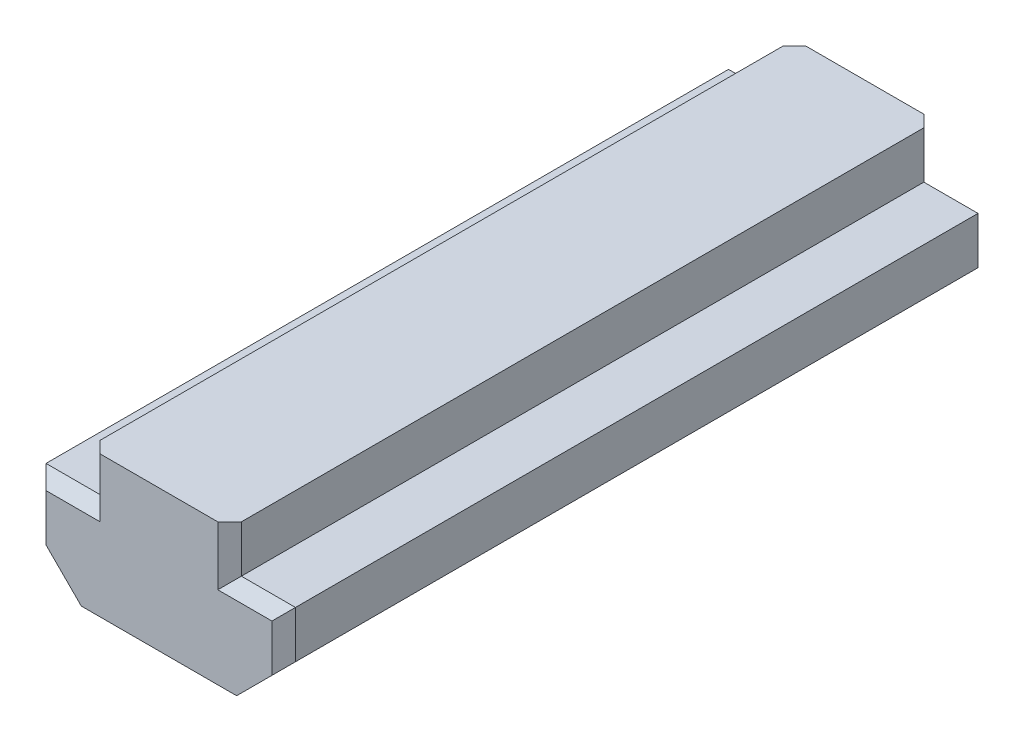
ISO-10303-21;
HEADER;
FILE_DESCRIPTION(('STEP AP214'),'2;1');
FILE_NAME('part.step','',(''),(''),'','','');
FILE_SCHEMA(('AUTOMOTIVE_DESIGN { 1 0 10303 214 1 1 1 1 }'));
ENDSEC;
DATA;
#1=APPLICATION_CONTEXT('core data for automotive mechanical design processes');
#2=APPLICATION_PROTOCOL_DEFINITION('international standard','automotive_design',2000,#1);
#3=PRODUCT_CONTEXT('',#1,'mechanical');
#4=PRODUCT('Part','Part','',(#3));
#5=PRODUCT_RELATED_PRODUCT_CATEGORY('part','',(#4));
#6=PRODUCT_DEFINITION_FORMATION('','',#4);
#7=PRODUCT_DEFINITION_CONTEXT('part definition',#1,'design');
#8=PRODUCT_DEFINITION('design','',#6,#7);
#9=PRODUCT_DEFINITION_SHAPE('','',#8);
#10=(LENGTH_UNIT() NAMED_UNIT(*) SI_UNIT(.MILLI.,.METRE.));
#11=(NAMED_UNIT(*) PLANE_ANGLE_UNIT() SI_UNIT($,.RADIAN.));
#12=(NAMED_UNIT(*) SI_UNIT($,.STERADIAN.) SOLID_ANGLE_UNIT());
#13=UNCERTAINTY_MEASURE_WITH_UNIT(LENGTH_MEASURE(1.E-05),#10,'distance_accuracy_value','');
#14=(GEOMETRIC_REPRESENTATION_CONTEXT(3) GLOBAL_UNCERTAINTY_ASSIGNED_CONTEXT((#13)) GLOBAL_UNIT_ASSIGNED_CONTEXT((#10,
#11,#12)) REPRESENTATION_CONTEXT('',''));
#15=CARTESIAN_POINT('',(0.,0.,0.));
#16=DIRECTION('',(0.,0.,1.));
#17=DIRECTION('',(1.,0.,0.));
#18=AXIS2_PLACEMENT_3D('',#15,#16,#17);
#19=CARTESIAN_POINT('',(-3.,0.,15.));
#20=DIRECTION('',(0.,-1.,0.));
#21=DIRECTION('',(0.,0.,-1.));
#22=AXIS2_PLACEMENT_3D('',#19,#20,#21);
#23=PLANE('',#22);
#24=DIRECTION('',(-0.707106781186545,0.,0.70710678118655));
#25=VECTOR('',#24,1.);
#26=CARTESIAN_POINT('',(-2.5,0.,-15.));
#27=LINE('',#26,#25);
#28=CARTESIAN_POINT('',(-3.,0.,-14.5));
#29=VERTEX_POINT('',#28);
#30=CARTESIAN_POINT('',(-2.5,0.,-15.));
#31=VERTEX_POINT('',#30);
#32=EDGE_CURVE('E173',#29,#31,#27,.F.);
#33=ORIENTED_EDGE('',*,*,#32,.F.);
#34=DIRECTION('',(0.,0.,-1.));
#35=VECTOR('',#34,1.);
#36=CARTESIAN_POINT('',(-3.,0.,15.));
#37=LINE('',#36,#35);
#38=CARTESIAN_POINT('',(-3.,0.,14.5));
#39=VERTEX_POINT('',#38);
#40=EDGE_CURVE('E185',#39,#29,#37,.T.);
#41=ORIENTED_EDGE('',*,*,#40,.F.);
#42=DIRECTION('',(-0.707106781186545,0.,-0.70710678118655));
#43=VECTOR('',#42,1.);
#44=CARTESIAN_POINT('',(-2.5,0.,15.));
#45=LINE('',#44,#43);
#46=CARTESIAN_POINT('',(-2.5,0.,15.));
#47=VERTEX_POINT('',#46);
#48=EDGE_CURVE('E243',#39,#47,#45,.F.);
#49=ORIENTED_EDGE('',*,*,#48,.T.);
#50=DIRECTION('',(-1.,0.,0.));
#51=VECTOR('',#50,1.);
#52=CARTESIAN_POINT('',(-3.,0.,15.));
#53=LINE('',#52,#51);
#54=CARTESIAN_POINT('',(2.5,0.,15.));
#55=VERTEX_POINT('',#54);
#56=EDGE_CURVE('E277',#55,#47,#53,.T.);
#57=ORIENTED_EDGE('',*,*,#56,.F.);
#58=DIRECTION('',(-0.707106781186548,0.,0.707106781186548));
#59=VECTOR('',#58,1.);
#60=CARTESIAN_POINT('',(2.5,0.,15.));
#61=LINE('',#60,#59);
#62=CARTESIAN_POINT('',(3.,0.,14.5));
#63=VERTEX_POINT('',#62);
#64=EDGE_CURVE('E241',#55,#63,#61,.F.);
#65=ORIENTED_EDGE('',*,*,#64,.T.);
#66=DIRECTION('',(0.,0.,-1.));
#67=VECTOR('',#66,1.);
#68=CARTESIAN_POINT('',(3.,0.,15.));
#69=LINE('',#68,#67);
#70=CARTESIAN_POINT('',(3.,0.,-14.5));
#71=VERTEX_POINT('',#70);
#72=EDGE_CURVE('E194',#63,#71,#69,.T.);
#73=ORIENTED_EDGE('',*,*,#72,.T.);
#74=DIRECTION('',(-0.707106781186548,0.,-0.707106781186548));
#75=VECTOR('',#74,1.);
#76=CARTESIAN_POINT('',(2.5,0.,-15.));
#77=LINE('',#76,#75);
#78=CARTESIAN_POINT('',(2.5,0.,-15.));
#79=VERTEX_POINT('',#78);
#80=EDGE_CURVE('E331',#79,#71,#77,.F.);
#81=ORIENTED_EDGE('',*,*,#80,.F.);
#82=DIRECTION('',(-1.,0.,0.));
#83=VECTOR('',#82,1.);
#84=CARTESIAN_POINT('',(-3.,0.,-15.));
#85=LINE('',#84,#83);
#86=EDGE_CURVE('E189',#79,#31,#85,.T.);
#87=ORIENTED_EDGE('',*,*,#86,.T.);
#88=EDGE_LOOP('',(#33,#41,#49,#57,#65,#73,#81,#87));
#89=FACE_BOUND('',#88,.T.);
#90=ADVANCED_FACE('F43',(#89),#23,.F.);
#91=CARTESIAN_POINT('',(0.,0.,-15.));
#92=DIRECTION('',(0.,0.,-1.));
#93=DIRECTION('',(-1.,0.,0.));
#94=AXIS2_PLACEMENT_3D('',#91,#92,#93);
#95=PLANE('',#94);
#96=DIRECTION('',(0.707106781186546,-0.707106781186549,0.));
#97=VECTOR('',#96,1.);
#98=CARTESIAN_POINT('',(-4.65000000000001,-4.64999999999999,-15.));
#99=LINE('',#98,#97);
#100=CARTESIAN_POINT('',(-3.3,-6.,-15.));
#101=VERTEX_POINT('',#100);
#102=CARTESIAN_POINT('',(-4.80000000000002,-4.49999999999998,-15.));
#103=VERTEX_POINT('',#102);
#104=EDGE_CURVE('E209',#101,#103,#99,.F.);
#105=ORIENTED_EDGE('',*,*,#104,.T.);
#106=DIRECTION('',(0.,-1.,0.));
#107=VECTOR('',#106,1.);
#108=CARTESIAN_POINT('',(-4.8,0.,-15.));
#109=LINE('',#108,#107);
#110=CARTESIAN_POINT('',(-4.8,-2.5,-15.));
#111=VERTEX_POINT('',#110);
#112=EDGE_CURVE('E61',#111,#103,#109,.T.);
#113=ORIENTED_EDGE('',*,*,#112,.F.);
#114=DIRECTION('',(-1.,0.,0.));
#115=VECTOR('',#114,1.);
#116=CARTESIAN_POINT('',(0.,-2.5,-15.));
#117=LINE('',#116,#115);
#118=CARTESIAN_POINT('',(-2.5,-2.5,-15.));
#119=VERTEX_POINT('',#118);
#120=EDGE_CURVE('E367',#119,#111,#117,.T.);
#121=ORIENTED_EDGE('',*,*,#120,.F.);
#122=DIRECTION('',(0.,-1.,0.));
#123=VECTOR('',#122,1.);
#124=CARTESIAN_POINT('',(-2.5,0.,-15.));
#125=LINE('',#124,#123);
#126=EDGE_CURVE('E375',#31,#119,#125,.T.);
#127=ORIENTED_EDGE('',*,*,#126,.F.);
#128=ORIENTED_EDGE('',*,*,#86,.F.);
#129=DIRECTION('',(0.,1.,0.));
#130=VECTOR('',#129,1.);
#131=CARTESIAN_POINT('',(2.5,0.,-15.));
#132=LINE('',#131,#130);
#133=CARTESIAN_POINT('',(2.5,-2.5,-15.));
#134=VERTEX_POINT('',#133);
#135=EDGE_CURVE('E337',#134,#79,#132,.T.);
#136=ORIENTED_EDGE('',*,*,#135,.F.);
#137=DIRECTION('',(-1.,0.,0.));
#138=VECTOR('',#137,1.);
#139=CARTESIAN_POINT('',(0.,-2.5,-15.));
#140=LINE('',#139,#138);
#141=CARTESIAN_POINT('',(4.8,-2.5,-15.));
#142=VERTEX_POINT('',#141);
#143=EDGE_CURVE('E344',#142,#134,#140,.T.);
#144=ORIENTED_EDGE('',*,*,#143,.F.);
#145=DIRECTION('',(0.,1.,0.));
#146=VECTOR('',#145,1.);
#147=CARTESIAN_POINT('',(4.8,0.,-15.));
#148=LINE('',#147,#146);
#149=CARTESIAN_POINT('',(4.8,-4.5,-15.));
#150=VERTEX_POINT('',#149);
#151=EDGE_CURVE('E263',#150,#142,#148,.T.);
#152=ORIENTED_EDGE('',*,*,#151,.F.);
#153=DIRECTION('',(0.707106781186549,0.707106781186546,0.));
#154=VECTOR('',#153,1.);
#155=CARTESIAN_POINT('',(4.64999999999999,-4.65000000000001,-15.));
#156=LINE('',#155,#154);
#157=CARTESIAN_POINT('',(3.3,-6.,-15.));
#158=VERTEX_POINT('',#157);
#159=EDGE_CURVE('E212',#150,#158,#156,.F.);
#160=ORIENTED_EDGE('',*,*,#159,.T.);
#161=DIRECTION('',(1.,0.,0.));
#162=VECTOR('',#161,1.);
#163=CARTESIAN_POINT('',(5.3,-6.,-15.));
#164=LINE('',#163,#162);
#165=EDGE_CURVE('E281',#101,#158,#164,.T.);
#166=ORIENTED_EDGE('',*,*,#165,.F.);
#167=EDGE_LOOP('',(#105,#113,#121,#127,#128,#136,#144,#152,#160,#166));
#168=FACE_BOUND('',#167,.T.);
#169=ADVANCED_FACE('F351',(#168),#95,.T.);
#170=CARTESIAN_POINT('',(-3.,0.,15.));
#171=DIRECTION('',(1.,0.,0.));
#172=DIRECTION('',(0.,0.,-1.));
#173=AXIS2_PLACEMENT_3D('',#170,#171,#172);
#174=PLANE('',#173);
#175=DIRECTION('',(0.,1.,0.));
#176=VECTOR('',#175,1.);
#177=CARTESIAN_POINT('',(-3.,0.,-14.5));
#178=LINE('',#177,#176);
#179=CARTESIAN_POINT('',(-3.,-2.,-14.5));
#180=VERTEX_POINT('',#179);
#181=EDGE_CURVE('E169',#180,#29,#178,.T.);
#182=ORIENTED_EDGE('',*,*,#181,.F.);
#183=DIRECTION('',(0.,0.,-1.));
#184=VECTOR('',#183,1.);
#185=CARTESIAN_POINT('',(-3.,-2.,15.));
#186=LINE('',#185,#184);
#187=CARTESIAN_POINT('',(-3.,-2.,14.5));
#188=VERTEX_POINT('',#187);
#189=EDGE_CURVE('E195',#188,#180,#186,.T.);
#190=ORIENTED_EDGE('',*,*,#189,.F.);
#191=DIRECTION('',(0.,1.,0.));
#192=VECTOR('',#191,1.);
#193=CARTESIAN_POINT('',(-3.,0.,14.5));
#194=LINE('',#193,#192);
#195=EDGE_CURVE('E193',#188,#39,#194,.T.);
#196=ORIENTED_EDGE('',*,*,#195,.T.);
#197=ORIENTED_EDGE('',*,*,#40,.T.);
#198=EDGE_LOOP('',(#182,#190,#196,#197));
#199=FACE_BOUND('',#198,.T.);
#200=ADVANCED_FACE('F191',(#199),#174,.F.);
#201=CARTESIAN_POINT('',(-3.,-2.,15.));
#202=DIRECTION('',(0.,-1.,0.));
#203=DIRECTION('',(1.,0.,0.));
#204=AXIS2_PLACEMENT_3D('',#201,#202,#203);
#205=PLANE('',#204);
#206=DIRECTION('',(1.,0.,0.));
#207=VECTOR('',#206,1.);
#208=CARTESIAN_POINT('',(-3.,-2.,-14.5));
#209=LINE('',#208,#207);
#210=CARTESIAN_POINT('',(-5.3,-2.,-14.5));
#211=VERTEX_POINT('',#210);
#212=EDGE_CURVE('E303',#211,#180,#209,.T.);
#213=ORIENTED_EDGE('',*,*,#212,.F.);
#214=DIRECTION('',(0.,0.,-1.));
#215=VECTOR('',#214,1.);
#216=CARTESIAN_POINT('',(-5.3,-2.,15.));
#217=LINE('',#216,#215);
#218=CARTESIAN_POINT('',(-5.3,-2.,14.5));
#219=VERTEX_POINT('',#218);
#220=EDGE_CURVE('E200',#219,#211,#217,.T.);
#221=ORIENTED_EDGE('',*,*,#220,.F.);
#222=DIRECTION('',(1.,0.,0.));
#223=VECTOR('',#222,1.);
#224=CARTESIAN_POINT('',(-3.,-2.,14.5));
#225=LINE('',#224,#223);
#226=EDGE_CURVE('E245',#219,#188,#225,.T.);
#227=ORIENTED_EDGE('',*,*,#226,.T.);
#228=ORIENTED_EDGE('',*,*,#189,.T.);
#229=EDGE_LOOP('',(#213,#221,#227,#228));
#230=FACE_BOUND('',#229,.T.);
#231=ADVANCED_FACE('F301',(#230),#205,.F.);
#232=CARTESIAN_POINT('',(-5.3,-2.,15.));
#233=DIRECTION('',(1.,0.,0.));
#234=DIRECTION('',(0.,1.,0.));
#235=AXIS2_PLACEMENT_3D('',#232,#233,#234);
#236=PLANE('',#235);
#237=DIRECTION('',(0.,1.,0.));
#238=VECTOR('',#237,1.);
#239=CARTESIAN_POINT('',(-5.3,-2.,-14.5));
#240=LINE('',#239,#238);
#241=CARTESIAN_POINT('',(-5.3,-3.99999999999999,-14.5));
#242=VERTEX_POINT('',#241);
#243=EDGE_CURVE('E295',#242,#211,#240,.T.);
#244=ORIENTED_EDGE('',*,*,#243,.F.);
#245=DIRECTION('',(0.,0.,1.));
#246=VECTOR('',#245,1.);
#247=CARTESIAN_POINT('',(-5.3,-3.99999999999999,15.));
#248=LINE('',#247,#246);
#249=CARTESIAN_POINT('',(-5.3,-3.99999999999999,14.5));
#250=VERTEX_POINT('',#249);
#251=EDGE_CURVE('E224',#242,#250,#248,.T.);
#252=ORIENTED_EDGE('',*,*,#251,.T.);
#253=DIRECTION('',(0.,1.,0.));
#254=VECTOR('',#253,1.);
#255=CARTESIAN_POINT('',(-5.3,-2.,14.5));
#256=LINE('',#255,#254);
#257=EDGE_CURVE('E250',#250,#219,#256,.T.);
#258=ORIENTED_EDGE('',*,*,#257,.T.);
#259=ORIENTED_EDGE('',*,*,#220,.T.);
#260=EDGE_LOOP('',(#244,#252,#258,#259));
#261=FACE_BOUND('',#260,.T.);
#262=ADVANCED_FACE('F293',(#261),#236,.F.);
#263=CARTESIAN_POINT('',(-3.3,-6.,15.));
#264=DIRECTION('',(0.707106781186549,0.707106781186546,0.));
#265=DIRECTION('',(0.,0.,-1.));
#266=AXIS2_PLACEMENT_3D('',#263,#264,#265);
#267=PLANE('',#266);
#268=ORIENTED_EDGE('',*,*,#251,.F.);
#269=DIRECTION('',(-0.577350269189623,0.577350269189626,0.577350269189628));
#270=VECTOR('',#269,1.);
#271=CARTESIAN_POINT('',(-3.80000000000001,-5.5,-16.));
#272=LINE('',#271,#270);
#273=EDGE_CURVE('E368',#103,#242,#272,.T.);
#274=ORIENTED_EDGE('',*,*,#273,.F.);
#275=ORIENTED_EDGE('',*,*,#104,.F.);
#276=DIRECTION('',(0.,0.,-1.));
#277=VECTOR('',#276,1.);
#278=CARTESIAN_POINT('',(-3.3,-6.,15.));
#279=LINE('',#278,#277);
#280=CARTESIAN_POINT('',(-3.3,-6.,15.));
#281=VERTEX_POINT('',#280);
#282=EDGE_CURVE('E214',#281,#101,#279,.T.);
#283=ORIENTED_EDGE('',*,*,#282,.F.);
#284=DIRECTION('',(-0.707106781186546,0.707106781186549,0.));
#285=VECTOR('',#284,1.);
#286=CARTESIAN_POINT('',(-3.3,-6.,15.));
#287=LINE('',#286,#285);
#288=CARTESIAN_POINT('',(-4.8,-4.5,15.));
#289=VERTEX_POINT('',#288);
#290=EDGE_CURVE('E219',#289,#281,#287,.F.);
#291=ORIENTED_EDGE('',*,*,#290,.F.);
#292=DIRECTION('',(-0.577350269189623,0.577350269189626,-0.577350269189628));
#293=VECTOR('',#292,1.);
#294=CARTESIAN_POINT('',(-3.80000000000001,-5.5,16.));
#295=LINE('',#294,#293);
#296=EDGE_CURVE('E247',#289,#250,#295,.T.);
#297=ORIENTED_EDGE('',*,*,#296,.T.);
#298=EDGE_LOOP('',(#268,#274,#275,#283,#291,#297));
#299=FACE_BOUND('',#298,.T.);
#300=ADVANCED_FACE('F364',(#299),#267,.F.);
#301=CARTESIAN_POINT('',(3.,-2.,15.));
#302=DIRECTION('',(0.,-1.,0.));
#303=DIRECTION('',(1.,0.,0.));
#304=AXIS2_PLACEMENT_3D('',#301,#302,#303);
#305=PLANE('',#304);
#306=DIRECTION('',(1.,0.,0.));
#307=VECTOR('',#306,1.);
#308=CARTESIAN_POINT('',(3.,-2.,-14.5));
#309=LINE('',#308,#307);
#310=CARTESIAN_POINT('',(3.,-2.,-14.5));
#311=VERTEX_POINT('',#310);
#312=CARTESIAN_POINT('',(5.3,-2.,-14.5));
#313=VERTEX_POINT('',#312);
#314=EDGE_CURVE('E341',#311,#313,#309,.T.);
#315=ORIENTED_EDGE('',*,*,#314,.F.);
#316=DIRECTION('',(0.,0.,-1.));
#317=VECTOR('',#316,1.);
#318=CARTESIAN_POINT('',(3.,-2.,15.));
#319=LINE('',#318,#317);
#320=CARTESIAN_POINT('',(3.,-2.,14.5));
#321=VERTEX_POINT('',#320);
#322=EDGE_CURVE('E198',#321,#311,#319,.T.);
#323=ORIENTED_EDGE('',*,*,#322,.F.);
#324=DIRECTION('',(1.,0.,0.));
#325=VECTOR('',#324,1.);
#326=CARTESIAN_POINT('',(3.,-2.,14.5));
#327=LINE('',#326,#325);
#328=CARTESIAN_POINT('',(5.3,-2.,14.5));
#329=VERTEX_POINT('',#328);
#330=EDGE_CURVE('E254',#321,#329,#327,.T.);
#331=ORIENTED_EDGE('',*,*,#330,.T.);
#332=DIRECTION('',(0.,0.,-1.));
#333=VECTOR('',#332,1.);
#334=CARTESIAN_POINT('',(5.3,-2.,15.));
#335=LINE('',#334,#333);
#336=EDGE_CURVE('E284',#329,#313,#335,.T.);
#337=ORIENTED_EDGE('',*,*,#336,.T.);
#338=EDGE_LOOP('',(#315,#323,#331,#337));
#339=FACE_BOUND('',#338,.T.);
#340=ADVANCED_FACE('F387',(#339),#305,.F.);
#341=CARTESIAN_POINT('',(3.,0.,15.));
#342=DIRECTION('',(-1.,0.,0.));
#343=DIRECTION('',(0.,0.,1.));
#344=AXIS2_PLACEMENT_3D('',#341,#342,#343);
#345=PLANE('',#344);
#346=DIRECTION('',(0.,-1.,0.));
#347=VECTOR('',#346,1.);
#348=CARTESIAN_POINT('',(3.,0.,-14.5));
#349=LINE('',#348,#347);
#350=EDGE_CURVE('E326',#71,#311,#349,.T.);
#351=ORIENTED_EDGE('',*,*,#350,.F.);
#352=ORIENTED_EDGE('',*,*,#72,.F.);
#353=DIRECTION('',(0.,-1.,0.));
#354=VECTOR('',#353,1.);
#355=CARTESIAN_POINT('',(3.,0.,14.5));
#356=LINE('',#355,#354);
#357=EDGE_CURVE('E252',#63,#321,#356,.T.);
#358=ORIENTED_EDGE('',*,*,#357,.T.);
#359=ORIENTED_EDGE('',*,*,#322,.T.);
#360=EDGE_LOOP('',(#351,#352,#358,#359));
#361=FACE_BOUND('',#360,.T.);
#362=ADVANCED_FACE('F323',(#361),#345,.F.);
#363=CARTESIAN_POINT('',(5.3,-2.,15.));
#364=DIRECTION('',(-1.,0.,0.));
#365=DIRECTION('',(0.,-1.,0.));
#366=AXIS2_PLACEMENT_3D('',#363,#364,#365);
#367=PLANE('',#366);
#368=DIRECTION('',(0.,-1.,0.));
#369=VECTOR('',#368,1.);
#370=CARTESIAN_POINT('',(5.3,-2.,-14.5));
#371=LINE('',#370,#369);
#372=CARTESIAN_POINT('',(5.3,-4.00000000000001,-14.5));
#373=VERTEX_POINT('',#372);
#374=EDGE_CURVE('E69',#313,#373,#371,.T.);
#375=ORIENTED_EDGE('',*,*,#374,.F.);
#376=ORIENTED_EDGE('',*,*,#336,.F.);
#377=DIRECTION('',(0.,-1.,0.));
#378=VECTOR('',#377,1.);
#379=CARTESIAN_POINT('',(5.3,-2.,14.5));
#380=LINE('',#379,#378);
#381=CARTESIAN_POINT('',(5.3,-4.00000000000001,14.5));
#382=VERTEX_POINT('',#381);
#383=EDGE_CURVE('E53',#329,#382,#380,.T.);
#384=ORIENTED_EDGE('',*,*,#383,.T.);
#385=DIRECTION('',(0.,0.,-1.));
#386=VECTOR('',#385,1.);
#387=CARTESIAN_POINT('',(5.3,-4.00000000000001,15.));
#388=LINE('',#387,#386);
#389=EDGE_CURVE('E206',#382,#373,#388,.T.);
#390=ORIENTED_EDGE('',*,*,#389,.T.);
#391=EDGE_LOOP('',(#375,#376,#384,#390));
#392=FACE_BOUND('',#391,.T.);
#393=ADVANCED_FACE('F385',(#392),#367,.F.);
#394=CARTESIAN_POINT('',(5.3,-4.00000000000001,15.));
#395=DIRECTION('',(-0.707106781186546,0.707106781186549,0.));
#396=DIRECTION('',(0.,0.,-1.));
#397=AXIS2_PLACEMENT_3D('',#394,#395,#396);
#398=PLANE('',#397);
#399=ORIENTED_EDGE('',*,*,#159,.F.);
#400=DIRECTION('',(-0.577350269189627,-0.577350269189624,-0.577350269189627));
#401=VECTOR('',#400,1.);
#402=CARTESIAN_POINT('',(5.13333333333333,-4.16666666666667,-14.6666666666667));
#403=LINE('',#402,#401);
#404=EDGE_CURVE('E273',#373,#150,#403,.T.);
#405=ORIENTED_EDGE('',*,*,#404,.F.);
#406=ORIENTED_EDGE('',*,*,#389,.F.);
#407=DIRECTION('',(-0.577350269189627,-0.577350269189624,0.577350269189627));
#408=VECTOR('',#407,1.);
#409=CARTESIAN_POINT('',(5.13333333333333,-4.16666666666667,14.6666666666667));
#410=LINE('',#409,#408);
#411=CARTESIAN_POINT('',(4.8,-4.5,15.));
#412=VERTEX_POINT('',#411);
#413=EDGE_CURVE('E11',#382,#412,#410,.T.);
#414=ORIENTED_EDGE('',*,*,#413,.T.);
#415=DIRECTION('',(-0.707106781186549,-0.707106781186546,0.));
#416=VECTOR('',#415,1.);
#417=CARTESIAN_POINT('',(5.3,-4.00000000000001,15.));
#418=LINE('',#417,#416);
#419=CARTESIAN_POINT('',(3.3,-6.,15.));
#420=VERTEX_POINT('',#419);
#421=EDGE_CURVE('E221',#420,#412,#418,.F.);
#422=ORIENTED_EDGE('',*,*,#421,.F.);
#423=DIRECTION('',(0.,0.,1.));
#424=VECTOR('',#423,1.);
#425=CARTESIAN_POINT('',(3.3,-6.,15.));
#426=LINE('',#425,#424);
#427=EDGE_CURVE('E217',#158,#420,#426,.T.);
#428=ORIENTED_EDGE('',*,*,#427,.F.);
#429=EDGE_LOOP('',(#399,#405,#406,#414,#422,#428));
#430=FACE_BOUND('',#429,.T.);
#431=ADVANCED_FACE('F355',(#430),#398,.F.);
#432=CARTESIAN_POINT('',(5.3,-6.,15.));
#433=DIRECTION('',(0.,1.,0.));
#434=DIRECTION('',(-1.,0.,0.));
#435=AXIS2_PLACEMENT_3D('',#432,#433,#434);
#436=PLANE('',#435);
#437=ORIENTED_EDGE('',*,*,#165,.T.);
#438=ORIENTED_EDGE('',*,*,#427,.T.);
#439=DIRECTION('',(1.,0.,0.));
#440=VECTOR('',#439,1.);
#441=CARTESIAN_POINT('',(5.3,-6.,15.));
#442=LINE('',#441,#440);
#443=EDGE_CURVE('E280',#281,#420,#442,.T.);
#444=ORIENTED_EDGE('',*,*,#443,.F.);
#445=ORIENTED_EDGE('',*,*,#282,.T.);
#446=EDGE_LOOP('',(#437,#438,#444,#445));
#447=FACE_BOUND('',#446,.T.);
#448=ADVANCED_FACE('F359',(#447),#436,.F.);
#449=CARTESIAN_POINT('',(0.,0.,15.));
#450=DIRECTION('',(0.,0.,-1.));
#451=DIRECTION('',(-1.,0.,0.));
#452=AXIS2_PLACEMENT_3D('',#449,#450,#451);
#453=PLANE('',#452);
#454=ORIENTED_EDGE('',*,*,#56,.T.);
#455=DIRECTION('',(0.,-1.,0.));
#456=VECTOR('',#455,1.);
#457=CARTESIAN_POINT('',(-2.5,0.,15.));
#458=LINE('',#457,#456);
#459=CARTESIAN_POINT('',(-2.5,-2.5,15.));
#460=VERTEX_POINT('',#459);
#461=EDGE_CURVE('E237',#47,#460,#458,.T.);
#462=ORIENTED_EDGE('',*,*,#461,.T.);
#463=DIRECTION('',(-1.,0.,0.));
#464=VECTOR('',#463,1.);
#465=CARTESIAN_POINT('',(0.,-2.5,15.));
#466=LINE('',#465,#464);
#467=CARTESIAN_POINT('',(-4.8,-2.5,15.));
#468=VERTEX_POINT('',#467);
#469=EDGE_CURVE('E235',#460,#468,#466,.T.);
#470=ORIENTED_EDGE('',*,*,#469,.T.);
#471=DIRECTION('',(0.,-1.,0.));
#472=VECTOR('',#471,1.);
#473=CARTESIAN_POINT('',(-4.8,0.,15.));
#474=LINE('',#473,#472);
#475=EDGE_CURVE('E233',#468,#289,#474,.T.);
#476=ORIENTED_EDGE('',*,*,#475,.T.);
#477=ORIENTED_EDGE('',*,*,#290,.T.);
#478=ORIENTED_EDGE('',*,*,#443,.T.);
#479=ORIENTED_EDGE('',*,*,#421,.T.);
#480=DIRECTION('',(0.,1.,0.));
#481=VECTOR('',#480,1.);
#482=CARTESIAN_POINT('',(4.8,0.,15.));
#483=LINE('',#482,#481);
#484=CARTESIAN_POINT('',(4.8,-2.5,15.));
#485=VERTEX_POINT('',#484);
#486=EDGE_CURVE('E226',#412,#485,#483,.T.);
#487=ORIENTED_EDGE('',*,*,#486,.T.);
#488=DIRECTION('',(-1.,0.,0.));
#489=VECTOR('',#488,1.);
#490=CARTESIAN_POINT('',(0.,-2.5,15.));
#491=LINE('',#490,#489);
#492=CARTESIAN_POINT('',(2.5,-2.5,15.));
#493=VERTEX_POINT('',#492);
#494=EDGE_CURVE('E228',#485,#493,#491,.T.);
#495=ORIENTED_EDGE('',*,*,#494,.T.);
#496=DIRECTION('',(0.,1.,0.));
#497=VECTOR('',#496,1.);
#498=CARTESIAN_POINT('',(2.5,0.,15.));
#499=LINE('',#498,#497);
#500=EDGE_CURVE('E230',#493,#55,#499,.T.);
#501=ORIENTED_EDGE('',*,*,#500,.T.);
#502=EDGE_LOOP('',(#454,#462,#470,#476,#477,#478,#479,#487,#495,#501));
#503=FACE_BOUND('',#502,.T.);
#504=ADVANCED_FACE('F317',(#503),#453,.F.);
#505=CARTESIAN_POINT('',(-4.8,0.,15.));
#506=DIRECTION('',(0.70710678118655,0.,-0.707106781186545));
#507=DIRECTION('',(0.,-1.,0.));
#508=AXIS2_PLACEMENT_3D('',#505,#506,#507);
#509=PLANE('',#508);
#510=ORIENTED_EDGE('',*,*,#296,.F.);
#511=ORIENTED_EDGE('',*,*,#475,.F.);
#512=DIRECTION('',(-0.577350269189624,0.577350269189625,-0.577350269189628));
#513=VECTOR('',#512,1.);
#514=CARTESIAN_POINT('',(-5.63333333333333,-1.66666666666667,14.1666666666667));
#515=LINE('',#514,#513);
#516=EDGE_CURVE('E259',#219,#468,#515,.F.);
#517=ORIENTED_EDGE('',*,*,#516,.F.);
#518=ORIENTED_EDGE('',*,*,#257,.F.);
#519=EDGE_LOOP('',(#510,#511,#517,#518));
#520=FACE_BOUND('',#519,.T.);
#521=ADVANCED_FACE('F307',(#520),#509,.F.);
#522=CARTESIAN_POINT('',(0.,-2.5,15.));
#523=DIRECTION('',(0.,-0.70710678118655,-0.707106781186545));
#524=DIRECTION('',(-1.,0.,0.));
#525=AXIS2_PLACEMENT_3D('',#522,#523,#524);
#526=PLANE('',#525);
#527=ORIENTED_EDGE('',*,*,#516,.T.);
#528=ORIENTED_EDGE('',*,*,#469,.F.);
#529=DIRECTION('',(-0.577350269189624,0.577350269189625,-0.577350269189628));
#530=VECTOR('',#529,1.);
#531=CARTESIAN_POINT('',(-3.33333333333333,-1.66666666666667,14.1666666666667));
#532=LINE('',#531,#530);
#533=EDGE_CURVE('E257',#188,#460,#532,.F.);
#534=ORIENTED_EDGE('',*,*,#533,.F.);
#535=ORIENTED_EDGE('',*,*,#226,.F.);
#536=EDGE_LOOP('',(#527,#528,#534,#535));
#537=FACE_BOUND('',#536,.T.);
#538=ADVANCED_FACE('F311',(#537),#526,.F.);
#539=CARTESIAN_POINT('',(-2.5,0.,15.));
#540=DIRECTION('',(0.70710678118655,0.,-0.707106781186545));
#541=DIRECTION('',(0.,-1.,0.));
#542=AXIS2_PLACEMENT_3D('',#539,#540,#541);
#543=PLANE('',#542);
#544=ORIENTED_EDGE('',*,*,#48,.F.);
#545=ORIENTED_EDGE('',*,*,#195,.F.);
#546=ORIENTED_EDGE('',*,*,#533,.T.);
#547=ORIENTED_EDGE('',*,*,#461,.F.);
#548=EDGE_LOOP('',(#544,#545,#546,#547));
#549=FACE_BOUND('',#548,.T.);
#550=ADVANCED_FACE('F314',(#549),#543,.F.);
#551=CARTESIAN_POINT('',(4.8,0.,15.));
#552=DIRECTION('',(-0.707106781186547,0.,-0.707106781186547));
#553=DIRECTION('',(0.,1.,0.));
#554=AXIS2_PLACEMENT_3D('',#551,#552,#553);
#555=PLANE('',#554);
#556=ORIENTED_EDGE('',*,*,#413,.F.);
#557=ORIENTED_EDGE('',*,*,#383,.F.);
#558=DIRECTION('',(-0.577350269189625,-0.577350269189626,0.577350269189626));
#559=VECTOR('',#558,1.);
#560=CARTESIAN_POINT('',(5.63333333333333,-1.66666666666666,14.1666666666667));
#561=LINE('',#560,#559);
#562=EDGE_CURVE('E48',#485,#329,#561,.F.);
#563=ORIENTED_EDGE('',*,*,#562,.F.);
#564=ORIENTED_EDGE('',*,*,#486,.F.);
#565=EDGE_LOOP('',(#556,#557,#563,#564));
#566=FACE_BOUND('',#565,.T.);
#567=ADVANCED_FACE('F46',(#566),#555,.F.);
#568=CARTESIAN_POINT('',(0.,-2.5,15.));
#569=DIRECTION('',(0.,-0.707106781186547,-0.707106781186548));
#570=DIRECTION('',(-1.,0.,0.));
#571=AXIS2_PLACEMENT_3D('',#568,#569,#570);
#572=PLANE('',#571);
#573=ORIENTED_EDGE('',*,*,#562,.T.);
#574=ORIENTED_EDGE('',*,*,#330,.F.);
#575=DIRECTION('',(-0.577350269189626,-0.577350269189626,0.577350269189626));
#576=VECTOR('',#575,1.);
#577=CARTESIAN_POINT('',(3.33333333333334,-1.66666666666666,14.1666666666667));
#578=LINE('',#577,#576);
#579=EDGE_CURVE('E261',#493,#321,#578,.F.);
#580=ORIENTED_EDGE('',*,*,#579,.F.);
#581=ORIENTED_EDGE('',*,*,#494,.F.);
#582=EDGE_LOOP('',(#573,#574,#580,#581));
#583=FACE_BOUND('',#582,.T.);
#584=ADVANCED_FACE('F390',(#583),#572,.F.);
#585=CARTESIAN_POINT('',(2.5,0.,15.));
#586=DIRECTION('',(-0.707106781186547,0.,-0.707106781186547));
#587=DIRECTION('',(0.,1.,0.));
#588=AXIS2_PLACEMENT_3D('',#585,#586,#587);
#589=PLANE('',#588);
#590=ORIENTED_EDGE('',*,*,#579,.T.);
#591=ORIENTED_EDGE('',*,*,#357,.F.);
#592=ORIENTED_EDGE('',*,*,#64,.F.);
#593=ORIENTED_EDGE('',*,*,#500,.F.);
#594=EDGE_LOOP('',(#590,#591,#592,#593));
#595=FACE_BOUND('',#594,.T.);
#596=ADVANCED_FACE('F319',(#595),#589,.F.);
#597=CARTESIAN_POINT('',(4.8,0.,-15.));
#598=DIRECTION('',(-0.707106781186547,0.,0.707106781186547));
#599=DIRECTION('',(0.,1.,0.));
#600=AXIS2_PLACEMENT_3D('',#597,#598,#599);
#601=PLANE('',#600);
#602=ORIENTED_EDGE('',*,*,#404,.T.);
#603=ORIENTED_EDGE('',*,*,#151,.T.);
#604=DIRECTION('',(-0.577350269189625,-0.577350269189626,-0.577350269189626));
#605=VECTOR('',#604,1.);
#606=CARTESIAN_POINT('',(5.63333333333333,-1.66666666666666,-14.1666666666667));
#607=LINE('',#606,#605);
#608=EDGE_CURVE('E339',#142,#313,#607,.F.);
#609=ORIENTED_EDGE('',*,*,#608,.T.);
#610=ORIENTED_EDGE('',*,*,#374,.T.);
#611=EDGE_LOOP('',(#602,#603,#609,#610));
#612=FACE_BOUND('',#611,.T.);
#613=ADVANCED_FACE('F346',(#612),#601,.F.);
#614=CARTESIAN_POINT('',(0.,-2.5,-15.));
#615=DIRECTION('',(0.,-0.707106781186547,0.707106781186548));
#616=DIRECTION('',(-1.,0.,0.));
#617=AXIS2_PLACEMENT_3D('',#614,#615,#616);
#618=PLANE('',#617);
#619=ORIENTED_EDGE('',*,*,#608,.F.);
#620=ORIENTED_EDGE('',*,*,#143,.T.);
#621=DIRECTION('',(-0.577350269189626,-0.577350269189626,-0.577350269189626));
#622=VECTOR('',#621,1.);
#623=CARTESIAN_POINT('',(3.33333333333334,-1.66666666666666,-14.1666666666667));
#624=LINE('',#623,#622);
#625=EDGE_CURVE('E329',#134,#311,#624,.F.);
#626=ORIENTED_EDGE('',*,*,#625,.T.);
#627=ORIENTED_EDGE('',*,*,#314,.T.);
#628=EDGE_LOOP('',(#619,#620,#626,#627));
#629=FACE_BOUND('',#628,.T.);
#630=ADVANCED_FACE('F381',(#629),#618,.F.);
#631=CARTESIAN_POINT('',(2.5,0.,-15.));
#632=DIRECTION('',(-0.707106781186547,0.,0.707106781186547));
#633=DIRECTION('',(0.,1.,0.));
#634=AXIS2_PLACEMENT_3D('',#631,#632,#633);
#635=PLANE('',#634);
#636=ORIENTED_EDGE('',*,*,#625,.F.);
#637=ORIENTED_EDGE('',*,*,#135,.T.);
#638=ORIENTED_EDGE('',*,*,#80,.T.);
#639=ORIENTED_EDGE('',*,*,#350,.T.);
#640=EDGE_LOOP('',(#636,#637,#638,#639));
#641=FACE_BOUND('',#640,.T.);
#642=ADVANCED_FACE('F379',(#641),#635,.F.);
#643=CARTESIAN_POINT('',(-4.8,0.,-15.));
#644=DIRECTION('',(0.70710678118655,0.,0.707106781186545));
#645=DIRECTION('',(0.,-1.,0.));
#646=AXIS2_PLACEMENT_3D('',#643,#644,#645);
#647=PLANE('',#646);
#648=ORIENTED_EDGE('',*,*,#273,.T.);
#649=ORIENTED_EDGE('',*,*,#243,.T.);
#650=DIRECTION('',(-0.577350269189624,0.577350269189625,0.577350269189628));
#651=VECTOR('',#650,1.);
#652=CARTESIAN_POINT('',(-5.63333333333333,-1.66666666666667,-14.1666666666667));
#653=LINE('',#652,#651);
#654=EDGE_CURVE('E373',#211,#111,#653,.F.);
#655=ORIENTED_EDGE('',*,*,#654,.T.);
#656=ORIENTED_EDGE('',*,*,#112,.T.);
#657=EDGE_LOOP('',(#648,#649,#655,#656));
#658=FACE_BOUND('',#657,.T.);
#659=ADVANCED_FACE('F501',(#658),#647,.F.);
#660=CARTESIAN_POINT('',(0.,-2.5,-15.));
#661=DIRECTION('',(0.,-0.70710678118655,0.707106781186545));
#662=DIRECTION('',(-1.,0.,0.));
#663=AXIS2_PLACEMENT_3D('',#660,#661,#662);
#664=PLANE('',#663);
#665=ORIENTED_EDGE('',*,*,#654,.F.);
#666=ORIENTED_EDGE('',*,*,#212,.T.);
#667=DIRECTION('',(-0.577350269189624,0.577350269189625,0.577350269189628));
#668=VECTOR('',#667,1.);
#669=CARTESIAN_POINT('',(-3.33333333333333,-1.66666666666667,-14.1666666666667));
#670=LINE('',#669,#668);
#671=EDGE_CURVE('E175',#180,#119,#670,.F.);
#672=ORIENTED_EDGE('',*,*,#671,.T.);
#673=ORIENTED_EDGE('',*,*,#120,.T.);
#674=EDGE_LOOP('',(#665,#666,#672,#673));
#675=FACE_BOUND('',#674,.T.);
#676=ADVANCED_FACE('F378',(#675),#664,.F.);
#677=CARTESIAN_POINT('',(-2.5,0.,-15.));
#678=DIRECTION('',(0.70710678118655,0.,0.707106781186545));
#679=DIRECTION('',(0.,-1.,0.));
#680=AXIS2_PLACEMENT_3D('',#677,#678,#679);
#681=PLANE('',#680);
#682=ORIENTED_EDGE('',*,*,#32,.T.);
#683=ORIENTED_EDGE('',*,*,#126,.T.);
#684=ORIENTED_EDGE('',*,*,#671,.F.);
#685=ORIENTED_EDGE('',*,*,#181,.T.);
#686=EDGE_LOOP('',(#682,#683,#684,#685));
#687=FACE_BOUND('',#686,.T.);
#688=ADVANCED_FACE('F171',(#687),#681,.F.);
#689=CLOSED_SHELL('',(#90,#169,#200,#231,#262,#300,#340,#362,#393,#431,#448,#504,#521,#538,#550,
#567,#584,#596,#613,#630,#642,#659,#676,#688));
#690=MANIFOLD_SOLID_BREP('B2',#689);
#691=ADVANCED_BREP_SHAPE_REPRESENTATION('',(#18,#690),#14);
#692=SHAPE_DEFINITION_REPRESENTATION(#9,#691);
ENDSEC;
END-ISO-10303-21;
